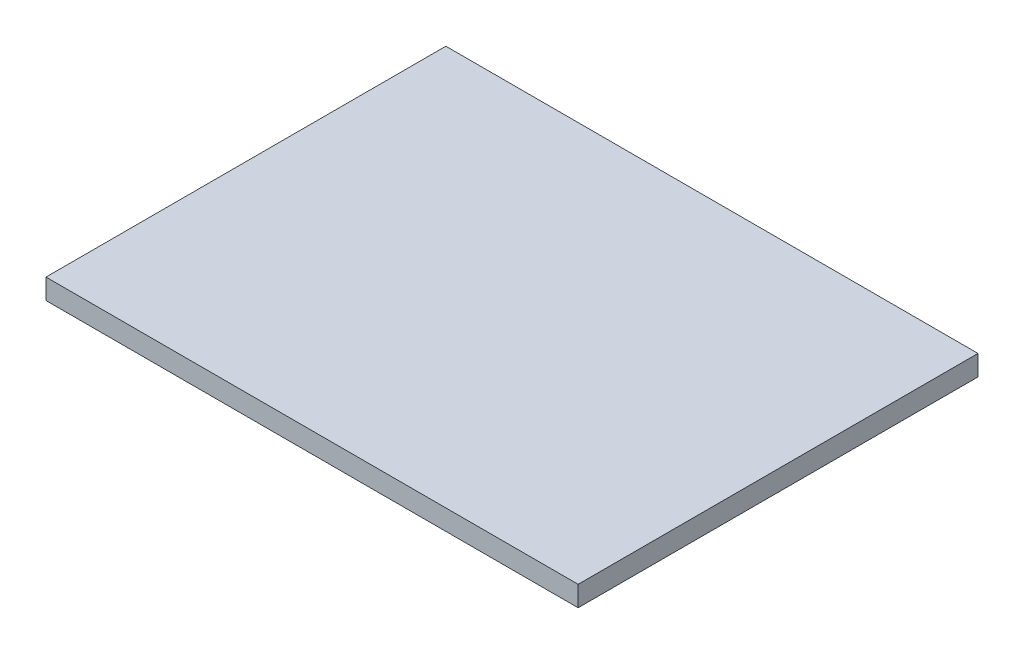
ISO-10303-21;
HEADER;
FILE_DESCRIPTION(('STEP AP214'),'2;1');
FILE_NAME('part.step','',(''),(''),'','','');
FILE_SCHEMA(('AUTOMOTIVE_DESIGN { 1 0 10303 214 1 1 1 1 }'));
ENDSEC;
DATA;
#1=APPLICATION_CONTEXT('core data for automotive mechanical design processes');
#2=APPLICATION_PROTOCOL_DEFINITION('international standard','automotive_design',2000,#1);
#3=PRODUCT_CONTEXT('',#1,'mechanical');
#4=PRODUCT('Part','Part','',(#3));
#5=PRODUCT_RELATED_PRODUCT_CATEGORY('part','',(#4));
#6=PRODUCT_DEFINITION_FORMATION('','',#4);
#7=PRODUCT_DEFINITION_CONTEXT('part definition',#1,'design');
#8=PRODUCT_DEFINITION('design','',#6,#7);
#9=PRODUCT_DEFINITION_SHAPE('','',#8);
#10=(LENGTH_UNIT() NAMED_UNIT(*) SI_UNIT(.MILLI.,.METRE.));
#11=(NAMED_UNIT(*) PLANE_ANGLE_UNIT() SI_UNIT($,.RADIAN.));
#12=(NAMED_UNIT(*) SI_UNIT($,.STERADIAN.) SOLID_ANGLE_UNIT());
#13=UNCERTAINTY_MEASURE_WITH_UNIT(LENGTH_MEASURE(1.E-05),#10,'distance_accuracy_value','');
#14=(GEOMETRIC_REPRESENTATION_CONTEXT(3) GLOBAL_UNCERTAINTY_ASSIGNED_CONTEXT((#13)) GLOBAL_UNIT_ASSIGNED_CONTEXT((#10,
#11,#12)) REPRESENTATION_CONTEXT('',''));
#15=CARTESIAN_POINT('',(0.,0.,0.));
#16=DIRECTION('',(0.,0.,1.));
#17=DIRECTION('',(1.,0.,0.));
#18=AXIS2_PLACEMENT_3D('',#15,#16,#17);
#19=CARTESIAN_POINT('',(0.,100.,0.));
#20=DIRECTION('',(1.,0.,0.));
#21=DIRECTION('',(0.,0.,-1.));
#22=AXIS2_PLACEMENT_3D('',#19,#20,#21);
#23=PLANE('',#22);
#24=DIRECTION('',(0.,0.,1.));
#25=VECTOR('',#24,1.);
#26=CARTESIAN_POINT('',(0.,0.,0.));
#27=LINE('',#26,#25);
#28=CARTESIAN_POINT('',(0.,0.,-1965.));
#29=VERTEX_POINT('',#28);
#30=CARTESIAN_POINT('',(0.,0.,0.));
#31=VERTEX_POINT('',#30);
#32=EDGE_CURVE('E111',#29,#31,#27,.T.);
#33=ORIENTED_EDGE('',*,*,#32,.T.);
#34=DIRECTION('',(0.,-1.,0.));
#35=VECTOR('',#34,1.);
#36=CARTESIAN_POINT('',(0.,100.,0.));
#37=LINE('',#36,#35);
#38=CARTESIAN_POINT('',(0.,100.,0.));
#39=VERTEX_POINT('',#38);
#40=EDGE_CURVE('E11',#39,#31,#37,.T.);
#41=ORIENTED_EDGE('',*,*,#40,.F.);
#42=DIRECTION('',(0.,0.,1.));
#43=VECTOR('',#42,1.);
#44=CARTESIAN_POINT('',(0.,100.,0.));
#45=LINE('',#44,#43);
#46=CARTESIAN_POINT('',(0.,100.,-1965.));
#47=VERTEX_POINT('',#46);
#48=EDGE_CURVE('E95',#47,#39,#45,.T.);
#49=ORIENTED_EDGE('',*,*,#48,.F.);
#50=DIRECTION('',(0.,-1.,0.));
#51=VECTOR('',#50,1.);
#52=CARTESIAN_POINT('',(0.,100.,-1965.));
#53=LINE('',#52,#51);
#54=EDGE_CURVE('E107',#47,#29,#53,.T.);
#55=ORIENTED_EDGE('',*,*,#54,.T.);
#56=EDGE_LOOP('',(#33,#41,#49,#55));
#57=FACE_BOUND('',#56,.T.);
#58=ADVANCED_FACE('F43',(#57),#23,.F.);
#59=CARTESIAN_POINT('',(0.,100.,0.));
#60=DIRECTION('',(0.,0.,-1.));
#61=DIRECTION('',(-1.,0.,0.));
#62=AXIS2_PLACEMENT_3D('',#59,#60,#61);
#63=PLANE('',#62);
#64=DIRECTION('',(1.,0.,0.));
#65=VECTOR('',#64,1.);
#66=CARTESIAN_POINT('',(0.,0.,0.));
#67=LINE('',#66,#65);
#68=CARTESIAN_POINT('',(2615.,0.,0.));
#69=VERTEX_POINT('',#68);
#70=EDGE_CURVE('E100',#31,#69,#67,.T.);
#71=ORIENTED_EDGE('',*,*,#70,.T.);
#72=DIRECTION('',(0.,-1.,0.));
#73=VECTOR('',#72,1.);
#74=CARTESIAN_POINT('',(2615.,100.,0.));
#75=LINE('',#74,#73);
#76=CARTESIAN_POINT('',(2615.,100.,0.));
#77=VERTEX_POINT('',#76);
#78=EDGE_CURVE('E52',#77,#69,#75,.T.);
#79=ORIENTED_EDGE('',*,*,#78,.F.);
#80=DIRECTION('',(1.,0.,0.));
#81=VECTOR('',#80,1.);
#82=CARTESIAN_POINT('',(0.,100.,0.));
#83=LINE('',#82,#81);
#84=EDGE_CURVE('E90',#39,#77,#83,.T.);
#85=ORIENTED_EDGE('',*,*,#84,.F.);
#86=ORIENTED_EDGE('',*,*,#40,.T.);
#87=EDGE_LOOP('',(#71,#79,#85,#86));
#88=FACE_BOUND('',#87,.T.);
#89=ADVANCED_FACE('F99',(#88),#63,.F.);
#90=CARTESIAN_POINT('',(2615.,100.,0.));
#91=DIRECTION('',(-1.,0.,0.));
#92=DIRECTION('',(0.,0.,1.));
#93=AXIS2_PLACEMENT_3D('',#90,#91,#92);
#94=PLANE('',#93);
#95=DIRECTION('',(0.,0.,-1.));
#96=VECTOR('',#95,1.);
#97=CARTESIAN_POINT('',(2615.,0.,0.));
#98=LINE('',#97,#96);
#99=CARTESIAN_POINT('',(2615.,0.,-1965.));
#100=VERTEX_POINT('',#99);
#101=EDGE_CURVE('E77',#69,#100,#98,.T.);
#102=ORIENTED_EDGE('',*,*,#101,.T.);
#103=DIRECTION('',(0.,-1.,0.));
#104=VECTOR('',#103,1.);
#105=CARTESIAN_POINT('',(2615.,100.,-1965.));
#106=LINE('',#105,#104);
#107=CARTESIAN_POINT('',(2615.,100.,-1965.));
#108=VERTEX_POINT('',#107);
#109=EDGE_CURVE('E102',#108,#100,#106,.T.);
#110=ORIENTED_EDGE('',*,*,#109,.F.);
#111=DIRECTION('',(0.,0.,-1.));
#112=VECTOR('',#111,1.);
#113=CARTESIAN_POINT('',(2615.,100.,0.));
#114=LINE('',#113,#112);
#115=EDGE_CURVE('E93',#77,#108,#114,.T.);
#116=ORIENTED_EDGE('',*,*,#115,.F.);
#117=ORIENTED_EDGE('',*,*,#78,.T.);
#118=EDGE_LOOP('',(#102,#110,#116,#117));
#119=FACE_BOUND('',#118,.T.);
#120=ADVANCED_FACE('F103',(#119),#94,.F.);
#121=CARTESIAN_POINT('',(0.,100.,-1965.));
#122=DIRECTION('',(0.,0.,1.));
#123=DIRECTION('',(1.,0.,0.));
#124=AXIS2_PLACEMENT_3D('',#121,#122,#123);
#125=PLANE('',#124);
#126=DIRECTION('',(-1.,0.,0.));
#127=VECTOR('',#126,1.);
#128=CARTESIAN_POINT('',(0.,0.,-1965.));
#129=LINE('',#128,#127);
#130=EDGE_CURVE('E83',#100,#29,#129,.T.);
#131=ORIENTED_EDGE('',*,*,#130,.T.);
#132=ORIENTED_EDGE('',*,*,#54,.F.);
#133=DIRECTION('',(-1.,0.,0.));
#134=VECTOR('',#133,1.);
#135=CARTESIAN_POINT('',(0.,100.,-1965.));
#136=LINE('',#135,#134);
#137=EDGE_CURVE('E60',#108,#47,#136,.T.);
#138=ORIENTED_EDGE('',*,*,#137,.F.);
#139=ORIENTED_EDGE('',*,*,#109,.T.);
#140=EDGE_LOOP('',(#131,#132,#138,#139));
#141=FACE_BOUND('',#140,.T.);
#142=ADVANCED_FACE('F124',(#141),#125,.F.);
#143=CARTESIAN_POINT('',(0.,100.,0.));
#144=DIRECTION('',(0.,-1.,0.));
#145=DIRECTION('',(0.,0.,-1.));
#146=AXIS2_PLACEMENT_3D('',#143,#144,#145);
#147=PLANE('',#146);
#148=ORIENTED_EDGE('',*,*,#48,.T.);
#149=ORIENTED_EDGE('',*,*,#84,.T.);
#150=ORIENTED_EDGE('',*,*,#115,.T.);
#151=ORIENTED_EDGE('',*,*,#137,.T.);
#152=EDGE_LOOP('',(#148,#149,#150,#151));
#153=FACE_BOUND('',#152,.T.);
#154=ADVANCED_FACE('F91',(#153),#147,.F.);
#155=CARTESIAN_POINT('',(0.,0.,0.));
#156=DIRECTION('',(0.,-1.,0.));
#157=DIRECTION('',(0.,0.,-1.));
#158=AXIS2_PLACEMENT_3D('',#155,#156,#157);
#159=PLANE('',#158);
#160=ORIENTED_EDGE('',*,*,#32,.F.);
#161=ORIENTED_EDGE('',*,*,#130,.F.);
#162=ORIENTED_EDGE('',*,*,#101,.F.);
#163=ORIENTED_EDGE('',*,*,#70,.F.);
#164=EDGE_LOOP('',(#160,#161,#162,#163));
#165=FACE_BOUND('',#164,.T.);
#166=ADVANCED_FACE('F127',(#165),#159,.T.);
#167=CLOSED_SHELL('',(#58,#89,#120,#142,#154,#166));
#168=MANIFOLD_SOLID_BREP('B2',#167);
#169=ADVANCED_BREP_SHAPE_REPRESENTATION('',(#18,#168),#14);
#170=SHAPE_DEFINITION_REPRESENTATION(#9,#169);
ENDSEC;
END-ISO-10303-21;
